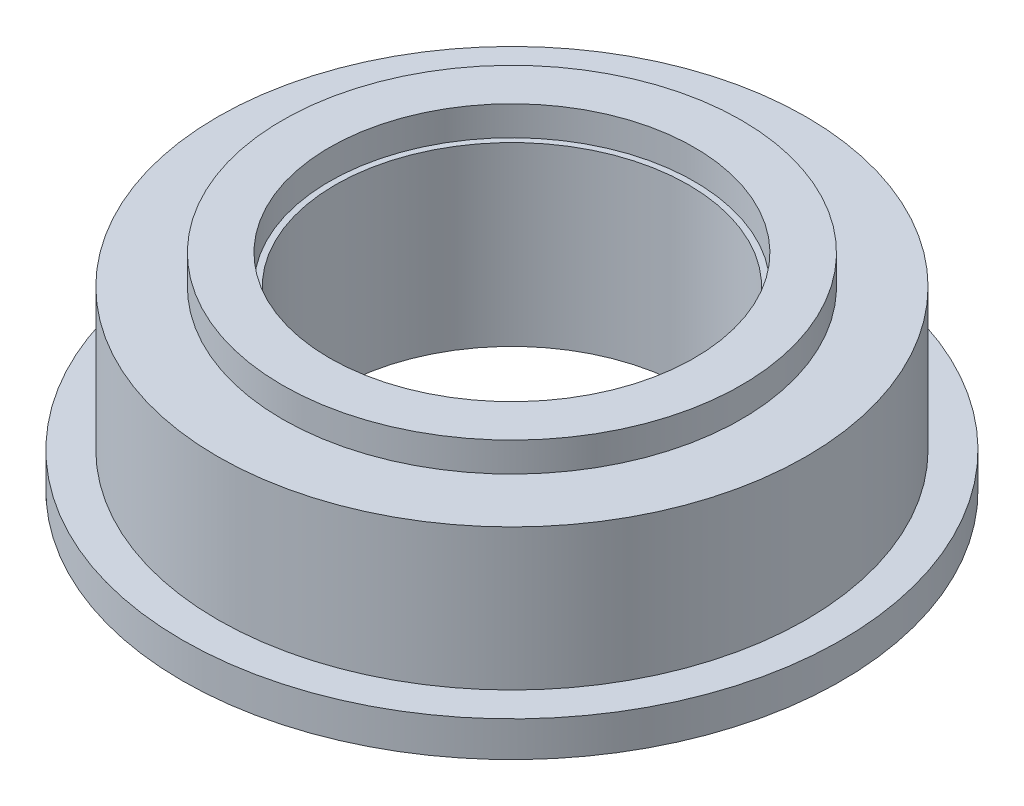
ISO-10303-21;
HEADER;
FILE_DESCRIPTION(('STEP AP214'),'2;1');
FILE_NAME('part.step','',(''),(''),'','','');
FILE_SCHEMA(('AUTOMOTIVE_DESIGN { 1 0 10303 214 1 1 1 1 }'));
ENDSEC;
DATA;
#1=APPLICATION_CONTEXT('core data for automotive mechanical design processes');
#2=APPLICATION_PROTOCOL_DEFINITION('international standard','automotive_design',2000,#1);
#3=PRODUCT_CONTEXT('',#1,'mechanical');
#4=PRODUCT('Part','Part','',(#3));
#5=PRODUCT_RELATED_PRODUCT_CATEGORY('part','',(#4));
#6=PRODUCT_DEFINITION_FORMATION('','',#4);
#7=PRODUCT_DEFINITION_CONTEXT('part definition',#1,'design');
#8=PRODUCT_DEFINITION('design','',#6,#7);
#9=PRODUCT_DEFINITION_SHAPE('','',#8);
#10=(LENGTH_UNIT() NAMED_UNIT(*) SI_UNIT(.MILLI.,.METRE.));
#11=(NAMED_UNIT(*) PLANE_ANGLE_UNIT() SI_UNIT($,.RADIAN.));
#12=(NAMED_UNIT(*) SI_UNIT($,.STERADIAN.) SOLID_ANGLE_UNIT());
#13=UNCERTAINTY_MEASURE_WITH_UNIT(LENGTH_MEASURE(1.E-05),#10,'distance_accuracy_value','');
#14=(GEOMETRIC_REPRESENTATION_CONTEXT(3) GLOBAL_UNCERTAINTY_ASSIGNED_CONTEXT((#13)) GLOBAL_UNIT_ASSIGNED_CONTEXT((#10,
#11,#12)) REPRESENTATION_CONTEXT('',''));
#15=CARTESIAN_POINT('',(0.,0.,0.));
#16=DIRECTION('',(0.,0.,1.));
#17=DIRECTION('',(1.,0.,0.));
#18=AXIS2_PLACEMENT_3D('',#15,#16,#17);
#19=CARTESIAN_POINT('',(0.,3.,0.));
#20=DIRECTION('',(0.,1.,0.));
#21=DIRECTION('',(0.,0.,1.));
#22=AXIS2_PLACEMENT_3D('',#19,#20,#21);
#23=PLANE('',#22);
#24=CARTESIAN_POINT('',(0.,3.,0.));
#25=DIRECTION('',(0.,1.,0.));
#26=DIRECTION('',(0.,0.,1.));
#27=AXIS2_PLACEMENT_3D('',#24,#25,#26);
#28=CIRCLE('',#27,3.);
#29=CARTESIAN_POINT('',(0.,3.,3.));
#30=VERTEX_POINT('',#29);
#31=EDGE_CURVE('E78',#30,#30,#28,.T.);
#32=ORIENTED_EDGE('',*,*,#31,.F.);
#33=EDGE_LOOP('',(#32));
#34=FACE_BOUND('',#33,.T.);
#35=CARTESIAN_POINT('',(0.,3.,0.));
#36=DIRECTION('',(0.,1.,0.));
#37=DIRECTION('',(0.,0.,1.));
#38=AXIS2_PLACEMENT_3D('',#35,#36,#37);
#39=CIRCLE('',#38,3.1);
#40=CARTESIAN_POINT('',(0.,3.,3.1));
#41=VERTEX_POINT('',#40);
#42=EDGE_CURVE('E10',#41,#41,#39,.F.);
#43=ORIENTED_EDGE('',*,*,#42,.F.);
#44=EDGE_LOOP('',(#43));
#45=FACE_BOUND('',#44,.T.);
#46=ADVANCED_FACE('F37',(#34,#45),#23,.T.);
#47=CARTESIAN_POINT('',(0.,0.6,0.));
#48=DIRECTION('',(0.,1.,0.));
#49=DIRECTION('',(0.,0.,1.));
#50=AXIS2_PLACEMENT_3D('',#47,#48,#49);
#51=PLANE('',#50);
#52=CARTESIAN_POINT('',(0.,0.6,0.));
#53=DIRECTION('',(0.,1.,0.));
#54=DIRECTION('',(0.,0.,1.));
#55=AXIS2_PLACEMENT_3D('',#52,#53,#54);
#56=CIRCLE('',#55,5.);
#57=CARTESIAN_POINT('',(0.,0.6,5.));
#58=VERTEX_POINT('',#57);
#59=EDGE_CURVE('E44',#58,#58,#56,.T.);
#60=ORIENTED_EDGE('',*,*,#59,.F.);
#61=EDGE_LOOP('',(#60));
#62=FACE_BOUND('',#61,.T.);
#63=CARTESIAN_POINT('',(0.,0.6,0.));
#64=DIRECTION('',(0.,1.,0.));
#65=DIRECTION('',(0.,0.,1.));
#66=AXIS2_PLACEMENT_3D('',#63,#64,#65);
#67=CIRCLE('',#66,5.6);
#68=CARTESIAN_POINT('',(0.,0.6,5.6));
#69=VERTEX_POINT('',#68);
#70=EDGE_CURVE('E48',#69,#69,#67,.T.);
#71=ORIENTED_EDGE('',*,*,#70,.T.);
#72=EDGE_LOOP('',(#71));
#73=FACE_BOUND('',#72,.T.);
#74=ADVANCED_FACE('F68',(#62,#73),#51,.T.);
#75=CARTESIAN_POINT('',(0.,0.,0.));
#76=DIRECTION('',(0.,1.,0.));
#77=DIRECTION('',(0.,0.,1.));
#78=AXIS2_PLACEMENT_3D('',#75,#76,#77);
#79=PLANE('',#78);
#80=CARTESIAN_POINT('',(0.,0.,0.));
#81=DIRECTION('',(0.,1.,0.));
#82=DIRECTION('',(0.,0.,1.));
#83=AXIS2_PLACEMENT_3D('',#80,#81,#82);
#84=CIRCLE('',#83,5.6);
#85=CARTESIAN_POINT('',(0.,0.,5.6));
#86=VERTEX_POINT('',#85);
#87=EDGE_CURVE('E53',#86,#86,#84,.T.);
#88=ORIENTED_EDGE('',*,*,#87,.F.);
#89=EDGE_LOOP('',(#88));
#90=FACE_BOUND('',#89,.T.);
#91=CARTESIAN_POINT('',(0.,0.,0.));
#92=DIRECTION('',(0.,1.,0.));
#93=DIRECTION('',(0.,0.,1.));
#94=AXIS2_PLACEMENT_3D('',#91,#92,#93);
#95=CIRCLE('',#94,3.);
#96=CARTESIAN_POINT('',(0.,0.,3.));
#97=VERTEX_POINT('',#96);
#98=EDGE_CURVE('E59',#97,#97,#95,.T.);
#99=ORIENTED_EDGE('',*,*,#98,.T.);
#100=EDGE_LOOP('',(#99));
#101=FACE_BOUND('',#100,.T.);
#102=ADVANCED_FACE('F65',(#90,#101),#79,.F.);
#103=CARTESIAN_POINT('',(0.,0.6,0.));
#104=DIRECTION('',(0.,-1.,0.));
#105=DIRECTION('',(0.,0.,-1.));
#106=AXIS2_PLACEMENT_3D('',#103,#104,#105);
#107=CYLINDRICAL_SURFACE('',#106,5.6);
#108=ORIENTED_EDGE('',*,*,#70,.F.);
#109=EDGE_LOOP('',(#108));
#110=FACE_BOUND('',#109,.T.);
#111=ORIENTED_EDGE('',*,*,#87,.T.);
#112=EDGE_LOOP('',(#111));
#113=FACE_BOUND('',#112,.T.);
#114=ADVANCED_FACE('F39',(#110,#113),#107,.T.);
#115=CARTESIAN_POINT('',(0.,0.6,0.));
#116=DIRECTION('',(0.,-1.,0.));
#117=DIRECTION('',(0.,0.,-1.));
#118=AXIS2_PLACEMENT_3D('',#115,#116,#117);
#119=CYLINDRICAL_SURFACE('',#118,3.);
#120=ORIENTED_EDGE('',*,*,#98,.F.);
#121=EDGE_LOOP('',(#120));
#122=FACE_BOUND('',#121,.T.);
#123=ORIENTED_EDGE('',*,*,#31,.T.);
#124=EDGE_LOOP('',(#123));
#125=FACE_BOUND('',#124,.T.);
#126=ADVANCED_FACE('F71',(#122,#125),#119,.F.);
#127=CARTESIAN_POINT('',(0.,3.,0.));
#128=DIRECTION('',(0.,1.,0.));
#129=DIRECTION('',(0.,0.,1.));
#130=AXIS2_PLACEMENT_3D('',#127,#128,#129);
#131=CIRCLE('',#130,3.9);
#132=CARTESIAN_POINT('',(0.,3.,3.9));
#133=VERTEX_POINT('',#132);
#134=EDGE_CURVE('E83',#133,#133,#131,.T.);
#135=ORIENTED_EDGE('',*,*,#134,.F.);
#136=EDGE_LOOP('',(#135));
#137=FACE_BOUND('',#136,.T.);
#138=CARTESIAN_POINT('',(0.,3.,0.));
#139=DIRECTION('',(0.,1.,0.));
#140=DIRECTION('',(0.,0.,1.));
#141=AXIS2_PLACEMENT_3D('',#138,#139,#140);
#142=CIRCLE('',#141,5.);
#143=CARTESIAN_POINT('',(0.,3.,5.));
#144=VERTEX_POINT('',#143);
#145=EDGE_CURVE('E57',#144,#144,#142,.T.);
#146=ORIENTED_EDGE('',*,*,#145,.T.);
#147=EDGE_LOOP('',(#146));
#148=FACE_BOUND('',#147,.T.);
#149=ADVANCED_FACE('F74',(#137,#148),#23,.T.);
#150=CARTESIAN_POINT('',(0.,3.,0.));
#151=DIRECTION('',(0.,-1.,0.));
#152=DIRECTION('',(0.,0.,-1.));
#153=AXIS2_PLACEMENT_3D('',#150,#151,#152);
#154=CYLINDRICAL_SURFACE('',#153,5.);
#155=ORIENTED_EDGE('',*,*,#145,.F.);
#156=EDGE_LOOP('',(#155));
#157=FACE_BOUND('',#156,.T.);
#158=ORIENTED_EDGE('',*,*,#59,.T.);
#159=EDGE_LOOP('',(#158));
#160=FACE_BOUND('',#159,.T.);
#161=ADVANCED_FACE('F97',(#157,#160),#154,.T.);
#162=CARTESIAN_POINT('',(0.,3.5,0.));
#163=DIRECTION('',(0.,1.,0.));
#164=DIRECTION('',(0.,0.,1.));
#165=AXIS2_PLACEMENT_3D('',#162,#163,#164);
#166=PLANE('',#165);
#167=CARTESIAN_POINT('',(0.,3.5,0.));
#168=DIRECTION('',(0.,1.,0.));
#169=DIRECTION('',(0.,0.,1.));
#170=AXIS2_PLACEMENT_3D('',#167,#168,#169);
#171=CIRCLE('',#170,3.9);
#172=CARTESIAN_POINT('',(0.,3.5,3.9));
#173=VERTEX_POINT('',#172);
#174=EDGE_CURVE('E80',#173,#173,#171,.T.);
#175=ORIENTED_EDGE('',*,*,#174,.T.);
#176=EDGE_LOOP('',(#175));
#177=FACE_BOUND('',#176,.T.);
#178=CARTESIAN_POINT('',(0.,3.5,0.));
#179=DIRECTION('',(0.,1.,0.));
#180=DIRECTION('',(0.,0.,1.));
#181=AXIS2_PLACEMENT_3D('',#178,#179,#180);
#182=CIRCLE('',#181,3.1);
#183=CARTESIAN_POINT('',(0.,3.5,3.1));
#184=VERTEX_POINT('',#183);
#185=EDGE_CURVE('E87',#184,#184,#182,.T.);
#186=ORIENTED_EDGE('',*,*,#185,.F.);
#187=EDGE_LOOP('',(#186));
#188=FACE_BOUND('',#187,.T.);
#189=ADVANCED_FACE('F94',(#177,#188),#166,.T.);
#190=CARTESIAN_POINT('',(0.,3.5,0.));
#191=DIRECTION('',(0.,-1.,0.));
#192=DIRECTION('',(0.,0.,-1.));
#193=AXIS2_PLACEMENT_3D('',#190,#191,#192);
#194=CYLINDRICAL_SURFACE('',#193,3.9);
#195=ORIENTED_EDGE('',*,*,#174,.F.);
#196=EDGE_LOOP('',(#195));
#197=FACE_BOUND('',#196,.T.);
#198=ORIENTED_EDGE('',*,*,#134,.T.);
#199=EDGE_LOOP('',(#198));
#200=FACE_BOUND('',#199,.T.);
#201=ADVANCED_FACE('F96',(#197,#200),#194,.T.);
#202=CARTESIAN_POINT('',(0.,3.5,0.));
#203=DIRECTION('',(0.,-1.,0.));
#204=DIRECTION('',(0.,0.,-1.));
#205=AXIS2_PLACEMENT_3D('',#202,#203,#204);
#206=CYLINDRICAL_SURFACE('',#205,3.1);
#207=ORIENTED_EDGE('',*,*,#185,.T.);
#208=EDGE_LOOP('',(#207));
#209=FACE_BOUND('',#208,.T.);
#210=ORIENTED_EDGE('',*,*,#42,.T.);
#211=EDGE_LOOP('',(#210));
#212=FACE_BOUND('',#211,.T.);
#213=ADVANCED_FACE('F92',(#209,#212),#206,.F.);
#214=CLOSED_SHELL('',(#46,#74,#102,#114,#126,#149,#161,#189,#201,#213));
#215=MANIFOLD_SOLID_BREP('B2',#214);
#216=ADVANCED_BREP_SHAPE_REPRESENTATION('',(#18,#215),#14);
#217=SHAPE_DEFINITION_REPRESENTATION(#9,#216);
ENDSEC;
END-ISO-10303-21;
